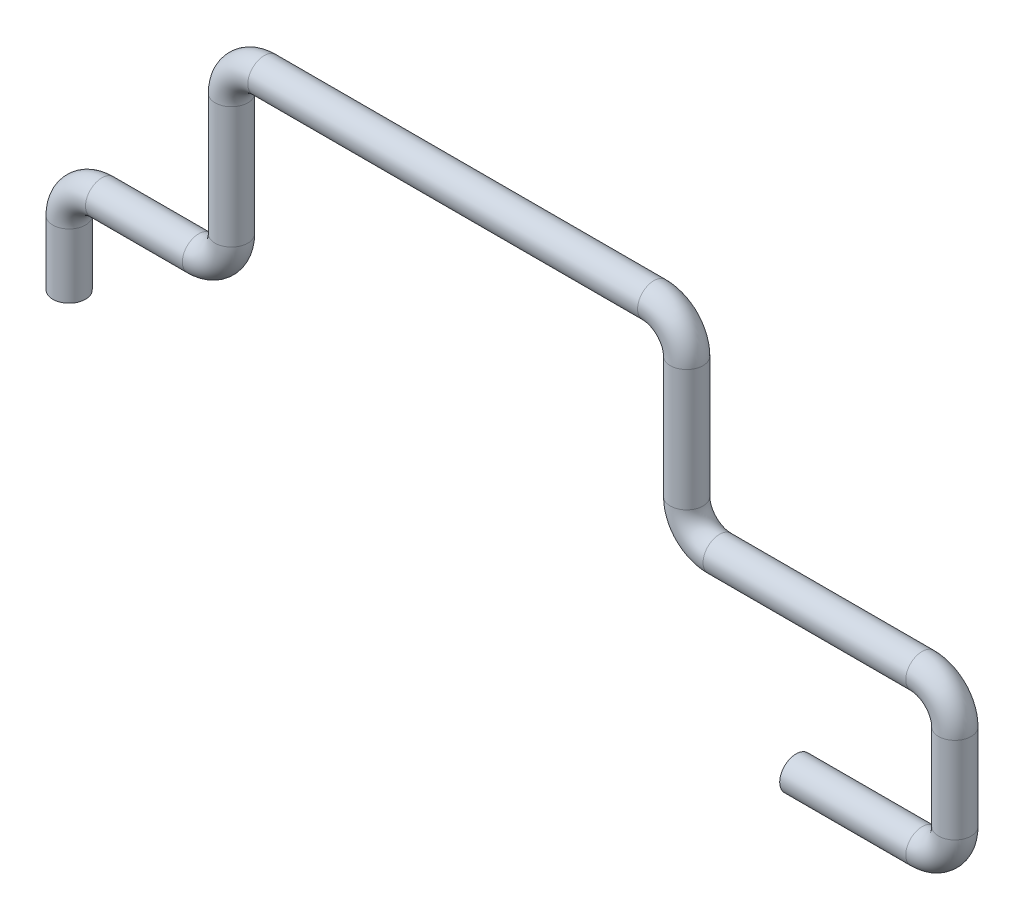
ISO-10303-21;
HEADER;
FILE_DESCRIPTION(('STEP AP214'),'2;1');
FILE_NAME('part.step','',(''),(''),'','','');
FILE_SCHEMA(('AUTOMOTIVE_DESIGN { 1 0 10303 214 1 1 1 1 }'));
ENDSEC;
DATA;
#1=APPLICATION_CONTEXT('core data for automotive mechanical design processes');
#2=APPLICATION_PROTOCOL_DEFINITION('international standard','automotive_design',2000,#1);
#3=PRODUCT_CONTEXT('',#1,'mechanical');
#4=PRODUCT('Part','Part','',(#3));
#5=PRODUCT_RELATED_PRODUCT_CATEGORY('part','',(#4));
#6=PRODUCT_DEFINITION_FORMATION('','',#4);
#7=PRODUCT_DEFINITION_CONTEXT('part definition',#1,'design');
#8=PRODUCT_DEFINITION('design','',#6,#7);
#9=PRODUCT_DEFINITION_SHAPE('','',#8);
#10=(LENGTH_UNIT() NAMED_UNIT(*) SI_UNIT(.MILLI.,.METRE.));
#11=(NAMED_UNIT(*) PLANE_ANGLE_UNIT() SI_UNIT($,.RADIAN.));
#12=(NAMED_UNIT(*) SI_UNIT($,.STERADIAN.) SOLID_ANGLE_UNIT());
#13=UNCERTAINTY_MEASURE_WITH_UNIT(LENGTH_MEASURE(1.E-05),#10,'distance_accuracy_value','');
#14=(GEOMETRIC_REPRESENTATION_CONTEXT(3) GLOBAL_UNCERTAINTY_ASSIGNED_CONTEXT((#13)) GLOBAL_UNIT_ASSIGNED_CONTEXT((#10,
#11,#12)) REPRESENTATION_CONTEXT('',''));
#15=CARTESIAN_POINT('',(0.,0.,0.));
#16=DIRECTION('',(0.,0.,1.));
#17=DIRECTION('',(1.,0.,0.));
#18=AXIS2_PLACEMENT_3D('',#15,#16,#17);
#19=CARTESIAN_POINT('',(0.,0.,0.));
#20=DIRECTION('',(0.,-1.,0.));
#21=DIRECTION('',(0.,0.,-1.));
#22=AXIS2_PLACEMENT_3D('',#19,#20,#21);
#23=PLANE('',#22);
#24=CARTESIAN_POINT('',(0.,0.,0.));
#25=DIRECTION('',(0.,-1.,0.));
#26=DIRECTION('',(0.,0.,-1.));
#27=AXIS2_PLACEMENT_3D('',#24,#25,#26);
#28=CIRCLE('',#27,2.49);
#29=CARTESIAN_POINT('',(0.,0.,-2.49));
#30=VERTEX_POINT('',#29);
#31=EDGE_CURVE('E110',#30,#30,#28,.T.);
#32=ORIENTED_EDGE('',*,*,#31,.F.);
#33=EDGE_LOOP('',(#32));
#34=FACE_BOUND('',#33,.T.);
#35=CARTESIAN_POINT('',(0.,0.,0.));
#36=DIRECTION('',(0.,-1.,0.));
#37=DIRECTION('',(0.,0.,-1.));
#38=AXIS2_PLACEMENT_3D('',#35,#36,#37);
#39=CIRCLE('',#38,2.5);
#40=CARTESIAN_POINT('',(0.,0.,-2.5));
#41=VERTEX_POINT('',#40);
#42=EDGE_CURVE('E103',#41,#41,#39,.T.);
#43=ORIENTED_EDGE('',*,*,#42,.T.);
#44=EDGE_LOOP('',(#43));
#45=FACE_BOUND('',#44,.T.);
#46=ADVANCED_FACE('F51',(#34,#45),#23,.T.);
#47=CARTESIAN_POINT('',(111.015935467083,-8.35314077543586,0.));
#48=DIRECTION('',(1.,0.,0.));
#49=DIRECTION('',(0.,0.,-1.));
#50=AXIS2_PLACEMENT_3D('',#47,#48,#49);
#51=PLANE('',#50);
#52=CARTESIAN_POINT('',(111.015935467083,-8.35314077543586,0.));
#53=DIRECTION('',(1.,0.,0.));
#54=DIRECTION('',(0.,0.,-1.));
#55=AXIS2_PLACEMENT_3D('',#52,#53,#54);
#56=CIRCLE('',#55,2.49);
#57=CARTESIAN_POINT('',(111.015935467083,-8.35314077543586,-2.49));
#58=VERTEX_POINT('',#57);
#59=EDGE_CURVE('E106',#58,#58,#56,.T.);
#60=ORIENTED_EDGE('',*,*,#59,.T.);
#61=EDGE_LOOP('',(#60));
#62=FACE_BOUND('',#61,.T.);
#63=CARTESIAN_POINT('',(111.015935467083,-8.35314077543586,0.));
#64=DIRECTION('',(1.,0.,0.));
#65=DIRECTION('',(0.,0.,-1.));
#66=AXIS2_PLACEMENT_3D('',#63,#64,#65);
#67=CIRCLE('',#66,2.5);
#68=CARTESIAN_POINT('',(111.015935467083,-8.35314077543586,-2.5));
#69=VERTEX_POINT('',#68);
#70=EDGE_CURVE('E11',#69,#69,#67,.T.);
#71=ORIENTED_EDGE('',*,*,#70,.F.);
#72=EDGE_LOOP('',(#71));
#73=FACE_BOUND('',#72,.T.);
#74=ADVANCED_FACE('F166',(#62,#73),#51,.F.);
#75=CARTESIAN_POINT('',(0.,0.,0.));
#76=DIRECTION('',(0.,1.,0.));
#77=DIRECTION('',(0.,0.,1.));
#78=AXIS2_PLACEMENT_3D('',#75,#76,#77);
#79=CYLINDRICAL_SURFACE('',#78,2.5);
#80=CARTESIAN_POINT('',(0.,9.82008847254746,0.));
#81=DIRECTION('',(0.,-1.,0.));
#82=DIRECTION('',(0.,0.,-1.));
#83=AXIS2_PLACEMENT_3D('',#80,#81,#82);
#84=CIRCLE('',#83,2.5);
#85=CARTESIAN_POINT('',(-2.5,9.82008847254745,0.));
#86=VERTEX_POINT('',#85);
#87=EDGE_CURVE('E100',#86,#86,#84,.T.);
#88=ORIENTED_EDGE('',*,*,#87,.T.);
#89=EDGE_LOOP('',(#88));
#90=FACE_BOUND('',#89,.T.);
#91=ORIENTED_EDGE('',*,*,#42,.F.);
#92=EDGE_LOOP('',(#91));
#93=FACE_BOUND('',#92,.T.);
#94=ADVANCED_FACE('F170',(#90,#93),#79,.T.);
#95=CARTESIAN_POINT('',(5.,9.8200884725475,0.));
#96=DIRECTION('',(0.,0.,-1.));
#97=DIRECTION('',(-1.,0.,0.));
#98=AXIS2_PLACEMENT_3D('',#95,#96,#97);
#99=TOROIDAL_SURFACE('',#98,5.,2.5);
#100=CARTESIAN_POINT('',(5.00000000000003,14.8200884725475,0.));
#101=DIRECTION('',(-1.,0.,0.));
#102=DIRECTION('',(0.,0.,-1.));
#103=AXIS2_PLACEMENT_3D('',#100,#101,#102);
#104=CIRCLE('',#103,2.5);
#105=CARTESIAN_POINT('',(5.00000000000005,17.3200884725475,0.));
#106=VERTEX_POINT('',#105);
#107=EDGE_CURVE('E97',#106,#106,#104,.T.);
#108=CARTESIAN_POINT('',(5.,9.8200884725475,0.));
#109=DIRECTION('',(0.,0.,-1.));
#110=DIRECTION('',(-1.,0.,0.));
#111=AXIS2_PLACEMENT_3D('',#108,#109,#110);
#112=CIRCLE('',#111,7.5);
#113=EDGE_CURVE('',#86,#106,#112,.T.);
#114=ORIENTED_EDGE('',*,*,#87,.F.);
#115=ORIENTED_EDGE('',*,*,#107,.T.);
#116=ORIENTED_EDGE('',*,*,#113,.T.);
#117=ORIENTED_EDGE('',*,*,#113,.F.);
#118=EDGE_LOOP('',(#114,#116,#115,#117));
#119=FACE_BOUND('',#118,.T.);
#120=ADVANCED_FACE('F172',(#119),#99,.T.);
#121=CARTESIAN_POINT('',(5.00000000000003,14.8200884725475,0.));
#122=DIRECTION('',(1.,0.,0.));
#123=DIRECTION('',(0.,0.,-1.));
#124=AXIS2_PLACEMENT_3D('',#121,#122,#123);
#125=CYLINDRICAL_SURFACE('',#124,2.5);
#126=CARTESIAN_POINT('',(19.7899661722612,14.8200884725475,0.));
#127=DIRECTION('',(-1.,0.,0.));
#128=DIRECTION('',(0.,0.,-1.));
#129=AXIS2_PLACEMENT_3D('',#126,#127,#128);
#130=CIRCLE('',#129,2.5);
#131=CARTESIAN_POINT('',(19.7899661722612,12.3200884725475,0.));
#132=VERTEX_POINT('',#131);
#133=EDGE_CURVE('E94',#132,#132,#130,.T.);
#134=ORIENTED_EDGE('',*,*,#133,.T.);
#135=EDGE_LOOP('',(#134));
#136=FACE_BOUND('',#135,.T.);
#137=ORIENTED_EDGE('',*,*,#107,.F.);
#138=EDGE_LOOP('',(#137));
#139=FACE_BOUND('',#138,.T.);
#140=ADVANCED_FACE('F178',(#136,#139),#125,.T.);
#141=CARTESIAN_POINT('',(19.7899661722613,19.8200884725475,0.));
#142=DIRECTION('',(0.,0.,1.));
#143=DIRECTION('',(1.,0.,0.));
#144=AXIS2_PLACEMENT_3D('',#141,#142,#143);
#145=TOROIDAL_SURFACE('',#144,5.,2.5);
#146=CARTESIAN_POINT('',(24.7899661722613,19.8200884725475,0.));
#147=DIRECTION('',(0.,-1.,0.));
#148=DIRECTION('',(0.,0.,-1.));
#149=AXIS2_PLACEMENT_3D('',#146,#147,#148);
#150=CIRCLE('',#149,2.5);
#151=CARTESIAN_POINT('',(27.2899661722613,19.8200884725475,0.));
#152=VERTEX_POINT('',#151);
#153=EDGE_CURVE('E91',#152,#152,#150,.T.);
#154=CARTESIAN_POINT('',(19.7899661722613,19.8200884725475,0.));
#155=DIRECTION('',(0.,0.,1.));
#156=DIRECTION('',(1.,0.,0.));
#157=AXIS2_PLACEMENT_3D('',#154,#155,#156);
#158=CIRCLE('',#157,7.5);
#159=EDGE_CURVE('',#132,#152,#158,.T.);
#160=ORIENTED_EDGE('',*,*,#133,.F.);
#161=ORIENTED_EDGE('',*,*,#153,.T.);
#162=ORIENTED_EDGE('',*,*,#159,.T.);
#163=ORIENTED_EDGE('',*,*,#159,.F.);
#164=EDGE_LOOP('',(#160,#162,#161,#163));
#165=FACE_BOUND('',#164,.T.);
#166=ADVANCED_FACE('F229',(#165),#145,.T.);
#167=CARTESIAN_POINT('',(24.7899661722613,19.8200884725475,0.));
#168=DIRECTION('',(0.,1.,0.));
#169=DIRECTION('',(0.,0.,1.));
#170=AXIS2_PLACEMENT_3D('',#167,#168,#169);
#171=CYLINDRICAL_SURFACE('',#170,2.5);
#172=CARTESIAN_POINT('',(24.7899661722613,38.3824408014572,0.));
#173=DIRECTION('',(0.,-1.,0.));
#174=DIRECTION('',(0.,0.,-1.));
#175=AXIS2_PLACEMENT_3D('',#172,#173,#174);
#176=CIRCLE('',#175,2.5);
#177=CARTESIAN_POINT('',(22.2899661722613,38.3824408014572,0.));
#178=VERTEX_POINT('',#177);
#179=EDGE_CURVE('E88',#178,#178,#176,.T.);
#180=ORIENTED_EDGE('',*,*,#179,.T.);
#181=EDGE_LOOP('',(#180));
#182=FACE_BOUND('',#181,.T.);
#183=ORIENTED_EDGE('',*,*,#153,.F.);
#184=EDGE_LOOP('',(#183));
#185=FACE_BOUND('',#184,.T.);
#186=ADVANCED_FACE('F225',(#182,#185),#171,.T.);
#187=CARTESIAN_POINT('',(29.7899661722613,38.3824408014572,0.));
#188=DIRECTION('',(0.,0.,-1.));
#189=DIRECTION('',(-1.,0.,0.));
#190=AXIS2_PLACEMENT_3D('',#187,#188,#189);
#191=TOROIDAL_SURFACE('',#190,5.,2.5);
#192=CARTESIAN_POINT('',(29.7899661722613,43.3824408014572,0.));
#193=DIRECTION('',(-1.,0.,0.));
#194=DIRECTION('',(0.,0.,-1.));
#195=AXIS2_PLACEMENT_3D('',#192,#193,#194);
#196=CIRCLE('',#195,2.5);
#197=CARTESIAN_POINT('',(29.7899661722613,45.8824408014572,0.));
#198=VERTEX_POINT('',#197);
#199=EDGE_CURVE('E85',#198,#198,#196,.T.);
#200=CARTESIAN_POINT('',(29.7899661722613,38.3824408014572,0.));
#201=DIRECTION('',(0.,0.,-1.));
#202=DIRECTION('',(-1.,0.,0.));
#203=AXIS2_PLACEMENT_3D('',#200,#201,#202);
#204=CIRCLE('',#203,7.5);
#205=EDGE_CURVE('',#178,#198,#204,.T.);
#206=ORIENTED_EDGE('',*,*,#179,.F.);
#207=ORIENTED_EDGE('',*,*,#199,.T.);
#208=ORIENTED_EDGE('',*,*,#205,.T.);
#209=ORIENTED_EDGE('',*,*,#205,.F.);
#210=EDGE_LOOP('',(#206,#208,#207,#209));
#211=FACE_BOUND('',#210,.T.);
#212=ADVANCED_FACE('F221',(#211),#191,.T.);
#213=CARTESIAN_POINT('',(29.7899661722613,43.3824408014572,0.));
#214=DIRECTION('',(1.,0.,0.));
#215=DIRECTION('',(0.,0.,-1.));
#216=AXIS2_PLACEMENT_3D('',#213,#214,#215);
#217=CYLINDRICAL_SURFACE('',#216,2.5);
#218=CARTESIAN_POINT('',(89.3096539162113,43.3824408014572,0.));
#219=DIRECTION('',(-1.,0.,0.));
#220=DIRECTION('',(0.,0.,-1.));
#221=AXIS2_PLACEMENT_3D('',#218,#219,#220);
#222=CIRCLE('',#221,2.5);
#223=CARTESIAN_POINT('',(89.3096539162112,45.8824408014572,0.));
#224=VERTEX_POINT('',#223);
#225=EDGE_CURVE('E82',#224,#224,#222,.T.);
#226=ORIENTED_EDGE('',*,*,#225,.T.);
#227=EDGE_LOOP('',(#226));
#228=FACE_BOUND('',#227,.T.);
#229=ORIENTED_EDGE('',*,*,#199,.F.);
#230=EDGE_LOOP('',(#229));
#231=FACE_BOUND('',#230,.T.);
#232=ADVANCED_FACE('F217',(#228,#231),#217,.T.);
#233=CARTESIAN_POINT('',(89.3096539162113,38.3824408014572,0.));
#234=DIRECTION('',(0.,0.,-1.));
#235=DIRECTION('',(-1.,0.,0.));
#236=AXIS2_PLACEMENT_3D('',#233,#234,#235);
#237=TOROIDAL_SURFACE('',#236,5.,2.5);
#238=CARTESIAN_POINT('',(94.3096539162113,38.3824408014572,0.));
#239=DIRECTION('',(0.,1.,0.));
#240=DIRECTION('',(0.,0.,-1.));
#241=AXIS2_PLACEMENT_3D('',#238,#239,#240);
#242=CIRCLE('',#241,2.5);
#243=CARTESIAN_POINT('',(96.8096539162113,38.3824408014572,0.));
#244=VERTEX_POINT('',#243);
#245=EDGE_CURVE('E79',#244,#244,#242,.T.);
#246=CARTESIAN_POINT('',(89.3096539162113,38.3824408014572,0.));
#247=DIRECTION('',(0.,0.,-1.));
#248=DIRECTION('',(-1.,0.,0.));
#249=AXIS2_PLACEMENT_3D('',#246,#247,#248);
#250=CIRCLE('',#249,7.5);
#251=EDGE_CURVE('',#224,#244,#250,.T.);
#252=ORIENTED_EDGE('',*,*,#225,.F.);
#253=ORIENTED_EDGE('',*,*,#245,.T.);
#254=ORIENTED_EDGE('',*,*,#251,.T.);
#255=ORIENTED_EDGE('',*,*,#251,.F.);
#256=EDGE_LOOP('',(#252,#254,#253,#255));
#257=FACE_BOUND('',#256,.T.);
#258=ADVANCED_FACE('F213',(#257),#237,.T.);
#259=CARTESIAN_POINT('',(94.3096539162113,38.3824408014572,0.));
#260=DIRECTION('',(0.,-1.,0.));
#261=DIRECTION('',(0.,0.,-1.));
#262=AXIS2_PLACEMENT_3D('',#259,#260,#261);
#263=CYLINDRICAL_SURFACE('',#262,2.5);
#264=CARTESIAN_POINT('',(94.3096539162113,19.8200884725475,0.));
#265=DIRECTION('',(0.,1.,0.));
#266=DIRECTION('',(0.,0.,-1.));
#267=AXIS2_PLACEMENT_3D('',#264,#265,#266);
#268=CIRCLE('',#267,2.5);
#269=CARTESIAN_POINT('',(91.8096539162113,19.8200884725475,0.));
#270=VERTEX_POINT('',#269);
#271=EDGE_CURVE('E76',#270,#270,#268,.T.);
#272=ORIENTED_EDGE('',*,*,#271,.T.);
#273=EDGE_LOOP('',(#272));
#274=FACE_BOUND('',#273,.T.);
#275=ORIENTED_EDGE('',*,*,#245,.F.);
#276=EDGE_LOOP('',(#275));
#277=FACE_BOUND('',#276,.T.);
#278=ADVANCED_FACE('F209',(#274,#277),#263,.T.);
#279=CARTESIAN_POINT('',(99.3096539162113,19.8200884725475,0.));
#280=DIRECTION('',(0.,0.,1.));
#281=DIRECTION('',(1.,0.,0.));
#282=AXIS2_PLACEMENT_3D('',#279,#280,#281);
#283=TOROIDAL_SURFACE('',#282,5.,2.5);
#284=CARTESIAN_POINT('',(99.3096539162113,14.8200884725475,0.));
#285=DIRECTION('',(-1.,0.,0.));
#286=DIRECTION('',(0.,0.,-1.));
#287=AXIS2_PLACEMENT_3D('',#284,#285,#286);
#288=CIRCLE('',#287,2.5);
#289=CARTESIAN_POINT('',(99.3096539162113,12.3200884725475,0.));
#290=VERTEX_POINT('',#289);
#291=EDGE_CURVE('E73',#290,#290,#288,.T.);
#292=CARTESIAN_POINT('',(99.3096539162113,19.8200884725475,0.));
#293=DIRECTION('',(0.,0.,1.));
#294=DIRECTION('',(1.,0.,0.));
#295=AXIS2_PLACEMENT_3D('',#292,#293,#294);
#296=CIRCLE('',#295,7.50000000000001);
#297=EDGE_CURVE('',#270,#290,#296,.T.);
#298=ORIENTED_EDGE('',*,*,#271,.F.);
#299=ORIENTED_EDGE('',*,*,#291,.T.);
#300=ORIENTED_EDGE('',*,*,#297,.T.);
#301=ORIENTED_EDGE('',*,*,#297,.F.);
#302=EDGE_LOOP('',(#298,#300,#299,#301));
#303=FACE_BOUND('',#302,.T.);
#304=ADVANCED_FACE('F205',(#303),#283,.T.);
#305=CARTESIAN_POINT('',(99.3096539162113,14.8200884725475,0.));
#306=DIRECTION('',(1.,0.,0.));
#307=DIRECTION('',(0.,0.,-1.));
#308=AXIS2_PLACEMENT_3D('',#305,#306,#307);
#309=CYLINDRICAL_SURFACE('',#308,2.5);
#310=CARTESIAN_POINT('',(130.266989331252,14.8200884725475,0.));
#311=DIRECTION('',(-1.,0.,0.));
#312=DIRECTION('',(0.,0.,-1.));
#313=AXIS2_PLACEMENT_3D('',#310,#311,#312);
#314=CIRCLE('',#313,2.5);
#315=CARTESIAN_POINT('',(130.266989331252,17.3200884725475,0.));
#316=VERTEX_POINT('',#315);
#317=EDGE_CURVE('E70',#316,#316,#314,.T.);
#318=ORIENTED_EDGE('',*,*,#317,.T.);
#319=EDGE_LOOP('',(#318));
#320=FACE_BOUND('',#319,.T.);
#321=ORIENTED_EDGE('',*,*,#291,.F.);
#322=EDGE_LOOP('',(#321));
#323=FACE_BOUND('',#322,.T.);
#324=ADVANCED_FACE('F201',(#320,#323),#309,.T.);
#325=CARTESIAN_POINT('',(130.266989331252,9.8200884725475,0.));
#326=DIRECTION('',(0.,0.,-1.));
#327=DIRECTION('',(-1.,0.,0.));
#328=AXIS2_PLACEMENT_3D('',#325,#326,#327);
#329=TOROIDAL_SURFACE('',#328,5.,2.5);
#330=CARTESIAN_POINT('',(135.266989331252,9.82008847254746,0.));
#331=DIRECTION('',(0.,1.,0.));
#332=DIRECTION('',(0.,0.,-1.));
#333=AXIS2_PLACEMENT_3D('',#330,#331,#332);
#334=CIRCLE('',#333,2.5);
#335=CARTESIAN_POINT('',(137.766989331252,9.82008847254745,0.));
#336=VERTEX_POINT('',#335);
#337=EDGE_CURVE('E65',#336,#336,#334,.T.);
#338=CARTESIAN_POINT('',(130.266989331252,9.8200884725475,0.));
#339=DIRECTION('',(0.,0.,-1.));
#340=DIRECTION('',(-1.,0.,0.));
#341=AXIS2_PLACEMENT_3D('',#338,#339,#340);
#342=CIRCLE('',#341,7.5);
#343=EDGE_CURVE('',#316,#336,#342,.T.);
#344=ORIENTED_EDGE('',*,*,#317,.F.);
#345=ORIENTED_EDGE('',*,*,#337,.T.);
#346=ORIENTED_EDGE('',*,*,#343,.T.);
#347=ORIENTED_EDGE('',*,*,#343,.F.);
#348=EDGE_LOOP('',(#344,#346,#345,#347));
#349=FACE_BOUND('',#348,.T.);
#350=ADVANCED_FACE('F197',(#349),#329,.T.);
#351=CARTESIAN_POINT('',(135.266989331252,9.82008847254746,0.));
#352=DIRECTION('',(0.,-1.,0.));
#353=DIRECTION('',(0.,0.,-1.));
#354=AXIS2_PLACEMENT_3D('',#351,#352,#353);
#355=CYLINDRICAL_SURFACE('',#354,2.5);
#356=CARTESIAN_POINT('',(135.266989331252,-3.35314077543583,0.));
#357=DIRECTION('',(0.,1.,0.));
#358=DIRECTION('',(0.,0.,-1.));
#359=AXIS2_PLACEMENT_3D('',#356,#357,#358);
#360=CIRCLE('',#359,2.5);
#361=CARTESIAN_POINT('',(137.766989331252,-3.35314077543581,0.));
#362=VERTEX_POINT('',#361);
#363=EDGE_CURVE('E61',#362,#362,#360,.T.);
#364=ORIENTED_EDGE('',*,*,#363,.T.);
#365=EDGE_LOOP('',(#364));
#366=FACE_BOUND('',#365,.T.);
#367=ORIENTED_EDGE('',*,*,#337,.F.);
#368=EDGE_LOOP('',(#367));
#369=FACE_BOUND('',#368,.T.);
#370=ADVANCED_FACE('F191',(#366,#369),#355,.T.);
#371=CARTESIAN_POINT('',(130.266989331252,-3.35314077543586,0.));
#372=DIRECTION('',(0.,0.,-1.));
#373=DIRECTION('',(-1.,0.,0.));
#374=AXIS2_PLACEMENT_3D('',#371,#372,#373);
#375=TOROIDAL_SURFACE('',#374,5.,2.5);
#376=CARTESIAN_POINT('',(130.266989331252,-8.35314077543525,0.));
#377=DIRECTION('',(1.,0.,0.));
#378=DIRECTION('',(0.,0.,-1.));
#379=AXIS2_PLACEMENT_3D('',#376,#377,#378);
#380=CIRCLE('',#379,2.5);
#381=CARTESIAN_POINT('',(130.266989331252,-10.8531407754359,0.));
#382=VERTEX_POINT('',#381);
#383=EDGE_CURVE('E57',#382,#382,#380,.T.);
#384=CARTESIAN_POINT('',(130.266989331252,-3.35314077543586,0.));
#385=DIRECTION('',(0.,0.,-1.));
#386=DIRECTION('',(-1.,0.,0.));
#387=AXIS2_PLACEMENT_3D('',#384,#385,#386);
#388=CIRCLE('',#387,7.50000000000001);
#389=EDGE_CURVE('',#362,#382,#388,.T.);
#390=ORIENTED_EDGE('',*,*,#363,.F.);
#391=ORIENTED_EDGE('',*,*,#383,.T.);
#392=ORIENTED_EDGE('',*,*,#389,.T.);
#393=ORIENTED_EDGE('',*,*,#389,.F.);
#394=EDGE_LOOP('',(#390,#392,#391,#393));
#395=FACE_BOUND('',#394,.T.);
#396=ADVANCED_FACE('F185',(#395),#375,.T.);
#397=CARTESIAN_POINT('',(130.266989331252,-8.35314077543586,0.));
#398=DIRECTION('',(-1.,0.,0.));
#399=DIRECTION('',(0.,0.,1.));
#400=AXIS2_PLACEMENT_3D('',#397,#398,#399);
#401=CYLINDRICAL_SURFACE('',#400,2.5);
#402=ORIENTED_EDGE('',*,*,#70,.T.);
#403=EDGE_LOOP('',(#402));
#404=FACE_BOUND('',#403,.T.);
#405=ORIENTED_EDGE('',*,*,#383,.F.);
#406=EDGE_LOOP('',(#405));
#407=FACE_BOUND('',#406,.T.);
#408=ADVANCED_FACE('F160',(#404,#407),#401,.T.);
#409=CARTESIAN_POINT('',(0.,0.,0.));
#410=DIRECTION('',(0.,1.,0.));
#411=DIRECTION('',(0.,0.,1.));
#412=AXIS2_PLACEMENT_3D('',#409,#410,#411);
#413=CYLINDRICAL_SURFACE('',#412,2.49);
#414=CARTESIAN_POINT('',(0.,9.82008847254746,0.));
#415=DIRECTION('',(0.,1.,0.));
#416=DIRECTION('',(0.,0.,1.));
#417=AXIS2_PLACEMENT_3D('',#414,#415,#416);
#418=CIRCLE('',#417,2.49);
#419=CARTESIAN_POINT('',(-2.49,9.82008847254745,0.));
#420=VERTEX_POINT('',#419);
#421=EDGE_CURVE('E113',#420,#420,#418,.F.);
#422=ORIENTED_EDGE('',*,*,#421,.F.);
#423=EDGE_LOOP('',(#422));
#424=FACE_BOUND('',#423,.T.);
#425=ORIENTED_EDGE('',*,*,#31,.T.);
#426=EDGE_LOOP('',(#425));
#427=FACE_BOUND('',#426,.T.);
#428=ADVANCED_FACE('F157',(#424,#427),#413,.F.);
#429=CARTESIAN_POINT('',(5.,9.8200884725475,0.));
#430=DIRECTION('',(0.,0.,-1.));
#431=DIRECTION('',(-1.,0.,0.));
#432=AXIS2_PLACEMENT_3D('',#429,#430,#431);
#433=TOROIDAL_SURFACE('',#432,5.,2.49);
#434=CARTESIAN_POINT('',(5.00000000000003,14.8200884725475,0.));
#435=DIRECTION('',(-1.,0.,0.));
#436=DIRECTION('',(0.,-1.,0.));
#437=AXIS2_PLACEMENT_3D('',#434,#435,#436);
#438=CIRCLE('',#437,2.49);
#439=CARTESIAN_POINT('',(5.00000000000005,17.3100884725475,0.));
#440=VERTEX_POINT('',#439);
#441=EDGE_CURVE('E149',#440,#440,#438,.T.);
#442=CARTESIAN_POINT('',(5.,9.8200884725475,0.));
#443=DIRECTION('',(0.,0.,-1.));
#444=DIRECTION('',(-1.,0.,0.));
#445=AXIS2_PLACEMENT_3D('',#442,#443,#444);
#446=CIRCLE('',#445,7.49);
#447=EDGE_CURVE('',#420,#440,#446,.T.);
#448=ORIENTED_EDGE('',*,*,#421,.T.);
#449=ORIENTED_EDGE('',*,*,#441,.F.);
#450=ORIENTED_EDGE('',*,*,#447,.T.);
#451=ORIENTED_EDGE('',*,*,#447,.F.);
#452=EDGE_LOOP('',(#448,#450,#449,#451));
#453=FACE_BOUND('',#452,.T.);
#454=ADVANCED_FACE('F155',(#453),#433,.F.);
#455=CARTESIAN_POINT('',(5.00000000000003,14.8200884725475,0.));
#456=DIRECTION('',(1.,0.,0.));
#457=DIRECTION('',(0.,0.,-1.));
#458=AXIS2_PLACEMENT_3D('',#455,#456,#457);
#459=CYLINDRICAL_SURFACE('',#458,2.49);
#460=CARTESIAN_POINT('',(19.7899661722612,14.8200884725475,0.));
#461=DIRECTION('',(1.,0.,0.));
#462=DIRECTION('',(0.,0.,-1.));
#463=AXIS2_PLACEMENT_3D('',#460,#461,#462);
#464=CIRCLE('',#463,2.49);
#465=CARTESIAN_POINT('',(19.7899661722612,12.3300884725475,0.));
#466=VERTEX_POINT('',#465);
#467=EDGE_CURVE('E146',#466,#466,#464,.F.);
#468=ORIENTED_EDGE('',*,*,#467,.F.);
#469=EDGE_LOOP('',(#468));
#470=FACE_BOUND('',#469,.T.);
#471=ORIENTED_EDGE('',*,*,#441,.T.);
#472=EDGE_LOOP('',(#471));
#473=FACE_BOUND('',#472,.T.);
#474=ADVANCED_FACE('F381',(#470,#473),#459,.F.);
#475=CARTESIAN_POINT('',(19.7899661722613,19.8200884725475,0.));
#476=DIRECTION('',(0.,0.,1.));
#477=DIRECTION('',(1.,0.,0.));
#478=AXIS2_PLACEMENT_3D('',#475,#476,#477);
#479=TOROIDAL_SURFACE('',#478,5.,2.49);
#480=CARTESIAN_POINT('',(24.7899661722613,19.8200884725475,0.));
#481=DIRECTION('',(0.,-1.,0.));
#482=DIRECTION('',(1.,0.,0.));
#483=AXIS2_PLACEMENT_3D('',#480,#481,#482);
#484=CIRCLE('',#483,2.49);
#485=CARTESIAN_POINT('',(27.2799661722613,19.8200884725475,0.));
#486=VERTEX_POINT('',#485);
#487=EDGE_CURVE('E143',#486,#486,#484,.T.);
#488=CARTESIAN_POINT('',(19.7899661722613,19.8200884725475,0.));
#489=DIRECTION('',(0.,0.,1.));
#490=DIRECTION('',(1.,0.,0.));
#491=AXIS2_PLACEMENT_3D('',#488,#489,#490);
#492=CIRCLE('',#491,7.49);
#493=EDGE_CURVE('',#466,#486,#492,.T.);
#494=ORIENTED_EDGE('',*,*,#467,.T.);
#495=ORIENTED_EDGE('',*,*,#487,.F.);
#496=ORIENTED_EDGE('',*,*,#493,.T.);
#497=ORIENTED_EDGE('',*,*,#493,.F.);
#498=EDGE_LOOP('',(#494,#496,#495,#497));
#499=FACE_BOUND('',#498,.T.);
#500=ADVANCED_FACE('F391',(#499),#479,.F.);
#501=CARTESIAN_POINT('',(24.7899661722613,19.8200884725475,0.));
#502=DIRECTION('',(0.,1.,0.));
#503=DIRECTION('',(0.,0.,1.));
#504=AXIS2_PLACEMENT_3D('',#501,#502,#503);
#505=CYLINDRICAL_SURFACE('',#504,2.49);
#506=CARTESIAN_POINT('',(24.7899661722613,38.3824408014572,0.));
#507=DIRECTION('',(0.,1.,0.));
#508=DIRECTION('',(0.,0.,1.));
#509=AXIS2_PLACEMENT_3D('',#506,#507,#508);
#510=CIRCLE('',#509,2.49);
#511=CARTESIAN_POINT('',(22.2999661722613,38.3824408014572,0.));
#512=VERTEX_POINT('',#511);
#513=EDGE_CURVE('E140',#512,#512,#510,.F.);
#514=ORIENTED_EDGE('',*,*,#513,.F.);
#515=EDGE_LOOP('',(#514));
#516=FACE_BOUND('',#515,.T.);
#517=ORIENTED_EDGE('',*,*,#487,.T.);
#518=EDGE_LOOP('',(#517));
#519=FACE_BOUND('',#518,.T.);
#520=ADVANCED_FACE('F401',(#516,#519),#505,.F.);
#521=CARTESIAN_POINT('',(29.7899661722613,38.3824408014572,0.));
#522=DIRECTION('',(0.,0.,-1.));
#523=DIRECTION('',(-1.,0.,0.));
#524=AXIS2_PLACEMENT_3D('',#521,#522,#523);
#525=TOROIDAL_SURFACE('',#524,5.,2.49);
#526=CARTESIAN_POINT('',(29.7899661722613,43.3824408014572,0.));
#527=DIRECTION('',(-1.,0.,0.));
#528=DIRECTION('',(0.,-1.,0.));
#529=AXIS2_PLACEMENT_3D('',#526,#527,#528);
#530=CIRCLE('',#529,2.49);
#531=CARTESIAN_POINT('',(29.7899661722613,45.8724408014572,0.));
#532=VERTEX_POINT('',#531);
#533=EDGE_CURVE('E137',#532,#532,#530,.T.);
#534=CARTESIAN_POINT('',(29.7899661722613,38.3824408014572,0.));
#535=DIRECTION('',(0.,0.,-1.));
#536=DIRECTION('',(-1.,0.,0.));
#537=AXIS2_PLACEMENT_3D('',#534,#535,#536);
#538=CIRCLE('',#537,7.49);
#539=EDGE_CURVE('',#512,#532,#538,.T.);
#540=ORIENTED_EDGE('',*,*,#513,.T.);
#541=ORIENTED_EDGE('',*,*,#533,.F.);
#542=ORIENTED_EDGE('',*,*,#539,.T.);
#543=ORIENTED_EDGE('',*,*,#539,.F.);
#544=EDGE_LOOP('',(#540,#542,#541,#543));
#545=FACE_BOUND('',#544,.T.);
#546=ADVANCED_FACE('F411',(#545),#525,.F.);
#547=CARTESIAN_POINT('',(29.7899661722613,43.3824408014572,0.));
#548=DIRECTION('',(1.,0.,0.));
#549=DIRECTION('',(0.,0.,-1.));
#550=AXIS2_PLACEMENT_3D('',#547,#548,#549);
#551=CYLINDRICAL_SURFACE('',#550,2.49);
#552=CARTESIAN_POINT('',(89.3096539162113,43.3824408014572,0.));
#553=DIRECTION('',(1.,0.,0.));
#554=DIRECTION('',(0.,0.,-1.));
#555=AXIS2_PLACEMENT_3D('',#552,#553,#554);
#556=CIRCLE('',#555,2.49);
#557=CARTESIAN_POINT('',(89.3096539162112,45.8724408014572,0.));
#558=VERTEX_POINT('',#557);
#559=EDGE_CURVE('E134',#558,#558,#556,.F.);
#560=ORIENTED_EDGE('',*,*,#559,.F.);
#561=EDGE_LOOP('',(#560));
#562=FACE_BOUND('',#561,.T.);
#563=ORIENTED_EDGE('',*,*,#533,.T.);
#564=EDGE_LOOP('',(#563));
#565=FACE_BOUND('',#564,.T.);
#566=ADVANCED_FACE('F421',(#562,#565),#551,.F.);
#567=CARTESIAN_POINT('',(89.3096539162113,38.3824408014572,0.));
#568=DIRECTION('',(0.,0.,-1.));
#569=DIRECTION('',(-1.,0.,0.));
#570=AXIS2_PLACEMENT_3D('',#567,#568,#569);
#571=TOROIDAL_SURFACE('',#570,5.,2.49);
#572=CARTESIAN_POINT('',(94.3096539162113,38.3824408014572,0.));
#573=DIRECTION('',(0.,1.,0.));
#574=DIRECTION('',(-1.,0.,0.));
#575=AXIS2_PLACEMENT_3D('',#572,#573,#574);
#576=CIRCLE('',#575,2.49);
#577=CARTESIAN_POINT('',(96.7996539162113,38.3824408014572,0.));
#578=VERTEX_POINT('',#577);
#579=EDGE_CURVE('E131',#578,#578,#576,.T.);
#580=CARTESIAN_POINT('',(89.3096539162113,38.3824408014572,0.));
#581=DIRECTION('',(0.,0.,-1.));
#582=DIRECTION('',(-1.,0.,0.));
#583=AXIS2_PLACEMENT_3D('',#580,#581,#582);
#584=CIRCLE('',#583,7.49);
#585=EDGE_CURVE('',#558,#578,#584,.T.);
#586=ORIENTED_EDGE('',*,*,#559,.T.);
#587=ORIENTED_EDGE('',*,*,#579,.F.);
#588=ORIENTED_EDGE('',*,*,#585,.T.);
#589=ORIENTED_EDGE('',*,*,#585,.F.);
#590=EDGE_LOOP('',(#586,#588,#587,#589));
#591=FACE_BOUND('',#590,.T.);
#592=ADVANCED_FACE('F431',(#591),#571,.F.);
#593=CARTESIAN_POINT('',(94.3096539162113,38.3824408014572,0.));
#594=DIRECTION('',(0.,-1.,0.));
#595=DIRECTION('',(0.,0.,-1.));
#596=AXIS2_PLACEMENT_3D('',#593,#594,#595);
#597=CYLINDRICAL_SURFACE('',#596,2.49);
#598=CARTESIAN_POINT('',(94.3096539162113,19.8200884725475,0.));
#599=DIRECTION('',(0.,-1.,0.));
#600=DIRECTION('',(0.,0.,-1.));
#601=AXIS2_PLACEMENT_3D('',#598,#599,#600);
#602=CIRCLE('',#601,2.49);
#603=CARTESIAN_POINT('',(91.8196539162113,19.8200884725475,0.));
#604=VERTEX_POINT('',#603);
#605=EDGE_CURVE('E128',#604,#604,#602,.F.);
#606=ORIENTED_EDGE('',*,*,#605,.F.);
#607=EDGE_LOOP('',(#606));
#608=FACE_BOUND('',#607,.T.);
#609=ORIENTED_EDGE('',*,*,#579,.T.);
#610=EDGE_LOOP('',(#609));
#611=FACE_BOUND('',#610,.T.);
#612=ADVANCED_FACE('F441',(#608,#611),#597,.F.);
#613=CARTESIAN_POINT('',(99.3096539162113,19.8200884725475,0.));
#614=DIRECTION('',(0.,0.,1.));
#615=DIRECTION('',(1.,0.,0.));
#616=AXIS2_PLACEMENT_3D('',#613,#614,#615);
#617=TOROIDAL_SURFACE('',#616,5.,2.49);
#618=CARTESIAN_POINT('',(99.3096539162113,14.8200884725475,0.));
#619=DIRECTION('',(-1.,0.,0.));
#620=DIRECTION('',(0.,-1.,0.));
#621=AXIS2_PLACEMENT_3D('',#618,#619,#620);
#622=CIRCLE('',#621,2.49);
#623=CARTESIAN_POINT('',(99.3096539162113,12.3300884725475,0.));
#624=VERTEX_POINT('',#623);
#625=EDGE_CURVE('E125',#624,#624,#622,.T.);
#626=CARTESIAN_POINT('',(99.3096539162113,19.8200884725475,0.));
#627=DIRECTION('',(0.,0.,1.));
#628=DIRECTION('',(1.,0.,0.));
#629=AXIS2_PLACEMENT_3D('',#626,#627,#628);
#630=CIRCLE('',#629,7.49);
#631=EDGE_CURVE('',#604,#624,#630,.T.);
#632=ORIENTED_EDGE('',*,*,#605,.T.);
#633=ORIENTED_EDGE('',*,*,#625,.F.);
#634=ORIENTED_EDGE('',*,*,#631,.T.);
#635=ORIENTED_EDGE('',*,*,#631,.F.);
#636=EDGE_LOOP('',(#632,#634,#633,#635));
#637=FACE_BOUND('',#636,.T.);
#638=ADVANCED_FACE('F451',(#637),#617,.F.);
#639=CARTESIAN_POINT('',(99.3096539162113,14.8200884725475,0.));
#640=DIRECTION('',(1.,0.,0.));
#641=DIRECTION('',(0.,0.,-1.));
#642=AXIS2_PLACEMENT_3D('',#639,#640,#641);
#643=CYLINDRICAL_SURFACE('',#642,2.49);
#644=CARTESIAN_POINT('',(130.266989331252,14.8200884725475,0.));
#645=DIRECTION('',(1.,0.,0.));
#646=DIRECTION('',(0.,0.,-1.));
#647=AXIS2_PLACEMENT_3D('',#644,#645,#646);
#648=CIRCLE('',#647,2.49);
#649=CARTESIAN_POINT('',(130.266989331252,17.3100884725475,0.));
#650=VERTEX_POINT('',#649);
#651=EDGE_CURVE('E122',#650,#650,#648,.F.);
#652=ORIENTED_EDGE('',*,*,#651,.F.);
#653=EDGE_LOOP('',(#652));
#654=FACE_BOUND('',#653,.T.);
#655=ORIENTED_EDGE('',*,*,#625,.T.);
#656=EDGE_LOOP('',(#655));
#657=FACE_BOUND('',#656,.T.);
#658=ADVANCED_FACE('F461',(#654,#657),#643,.F.);
#659=CARTESIAN_POINT('',(130.266989331252,9.8200884725475,0.));
#660=DIRECTION('',(0.,0.,-1.));
#661=DIRECTION('',(-1.,0.,0.));
#662=AXIS2_PLACEMENT_3D('',#659,#660,#661);
#663=TOROIDAL_SURFACE('',#662,5.,2.49);
#664=CARTESIAN_POINT('',(135.266989331252,9.82008847254746,0.));
#665=DIRECTION('',(0.,1.,0.));
#666=DIRECTION('',(-1.,0.,0.));
#667=AXIS2_PLACEMENT_3D('',#664,#665,#666);
#668=CIRCLE('',#667,2.49);
#669=CARTESIAN_POINT('',(137.756989331252,9.82008847254745,0.));
#670=VERTEX_POINT('',#669);
#671=EDGE_CURVE('E119',#670,#670,#668,.T.);
#672=CARTESIAN_POINT('',(130.266989331252,9.8200884725475,0.));
#673=DIRECTION('',(0.,0.,-1.));
#674=DIRECTION('',(-1.,0.,0.));
#675=AXIS2_PLACEMENT_3D('',#672,#673,#674);
#676=CIRCLE('',#675,7.49);
#677=EDGE_CURVE('',#650,#670,#676,.T.);
#678=ORIENTED_EDGE('',*,*,#651,.T.);
#679=ORIENTED_EDGE('',*,*,#671,.F.);
#680=ORIENTED_EDGE('',*,*,#677,.T.);
#681=ORIENTED_EDGE('',*,*,#677,.F.);
#682=EDGE_LOOP('',(#678,#680,#679,#681));
#683=FACE_BOUND('',#682,.T.);
#684=ADVANCED_FACE('F471',(#683),#663,.F.);
#685=CARTESIAN_POINT('',(135.266989331252,9.82008847254746,0.));
#686=DIRECTION('',(0.,-1.,0.));
#687=DIRECTION('',(0.,0.,-1.));
#688=AXIS2_PLACEMENT_3D('',#685,#686,#687);
#689=CYLINDRICAL_SURFACE('',#688,2.49);
#690=CARTESIAN_POINT('',(135.266989331252,-3.35314077543583,0.));
#691=DIRECTION('',(0.,-1.,0.));
#692=DIRECTION('',(0.,0.,-1.));
#693=AXIS2_PLACEMENT_3D('',#690,#691,#692);
#694=CIRCLE('',#693,2.49);
#695=CARTESIAN_POINT('',(137.756989331252,-3.35314077543581,0.));
#696=VERTEX_POINT('',#695);
#697=EDGE_CURVE('E116',#696,#696,#694,.F.);
#698=ORIENTED_EDGE('',*,*,#697,.F.);
#699=EDGE_LOOP('',(#698));
#700=FACE_BOUND('',#699,.T.);
#701=ORIENTED_EDGE('',*,*,#671,.T.);
#702=EDGE_LOOP('',(#701));
#703=FACE_BOUND('',#702,.T.);
#704=ADVANCED_FACE('F481',(#700,#703),#689,.F.);
#705=CARTESIAN_POINT('',(130.266989331252,-3.35314077543586,0.));
#706=DIRECTION('',(0.,0.,-1.));
#707=DIRECTION('',(-1.,0.,0.));
#708=AXIS2_PLACEMENT_3D('',#705,#706,#707);
#709=TOROIDAL_SURFACE('',#708,5.,2.49);
#710=CARTESIAN_POINT('',(130.266989331252,-8.35314077543587,0.));
#711=DIRECTION('',(1.,0.,0.));
#712=DIRECTION('',(0.,1.,0.));
#713=AXIS2_PLACEMENT_3D('',#710,#711,#712);
#714=CIRCLE('',#713,2.49);
#715=CARTESIAN_POINT('',(130.266989331252,-10.8431407754359,0.));
#716=VERTEX_POINT('',#715);
#717=EDGE_CURVE('E109',#716,#716,#714,.T.);
#718=CARTESIAN_POINT('',(130.266989331252,-3.35314077543586,0.));
#719=DIRECTION('',(0.,0.,-1.));
#720=DIRECTION('',(-1.,0.,0.));
#721=AXIS2_PLACEMENT_3D('',#718,#719,#720);
#722=CIRCLE('',#721,7.49);
#723=EDGE_CURVE('',#696,#716,#722,.T.);
#724=ORIENTED_EDGE('',*,*,#697,.T.);
#725=ORIENTED_EDGE('',*,*,#717,.F.);
#726=ORIENTED_EDGE('',*,*,#723,.T.);
#727=ORIENTED_EDGE('',*,*,#723,.F.);
#728=EDGE_LOOP('',(#724,#726,#725,#727));
#729=FACE_BOUND('',#728,.T.);
#730=ADVANCED_FACE('F491',(#729),#709,.F.);
#731=CARTESIAN_POINT('',(130.266989331252,-8.35314077543586,0.));
#732=DIRECTION('',(-1.,0.,0.));
#733=DIRECTION('',(0.,0.,1.));
#734=AXIS2_PLACEMENT_3D('',#731,#732,#733);
#735=CYLINDRICAL_SURFACE('',#734,2.49);
#736=ORIENTED_EDGE('',*,*,#59,.F.);
#737=EDGE_LOOP('',(#736));
#738=FACE_BOUND('',#737,.T.);
#739=ORIENTED_EDGE('',*,*,#717,.T.);
#740=EDGE_LOOP('',(#739));
#741=FACE_BOUND('',#740,.T.);
#742=ADVANCED_FACE('F167',(#738,#741),#735,.F.);
#743=CLOSED_SHELL('',(#46,#74,#94,#120,#140,#166,#186,#212,#232,#258,#278,#304,#324,#350,#370,
#396,#408,#428,#454,#474,#500,#520,#546,#566,#592,#612,#638,#658,#684,#704,#730,#742));
#744=MANIFOLD_SOLID_BREP('B2',#743);
#745=ADVANCED_BREP_SHAPE_REPRESENTATION('',(#18,#744),#14);
#746=SHAPE_DEFINITION_REPRESENTATION(#9,#745);
ENDSEC;
END-ISO-10303-21;
